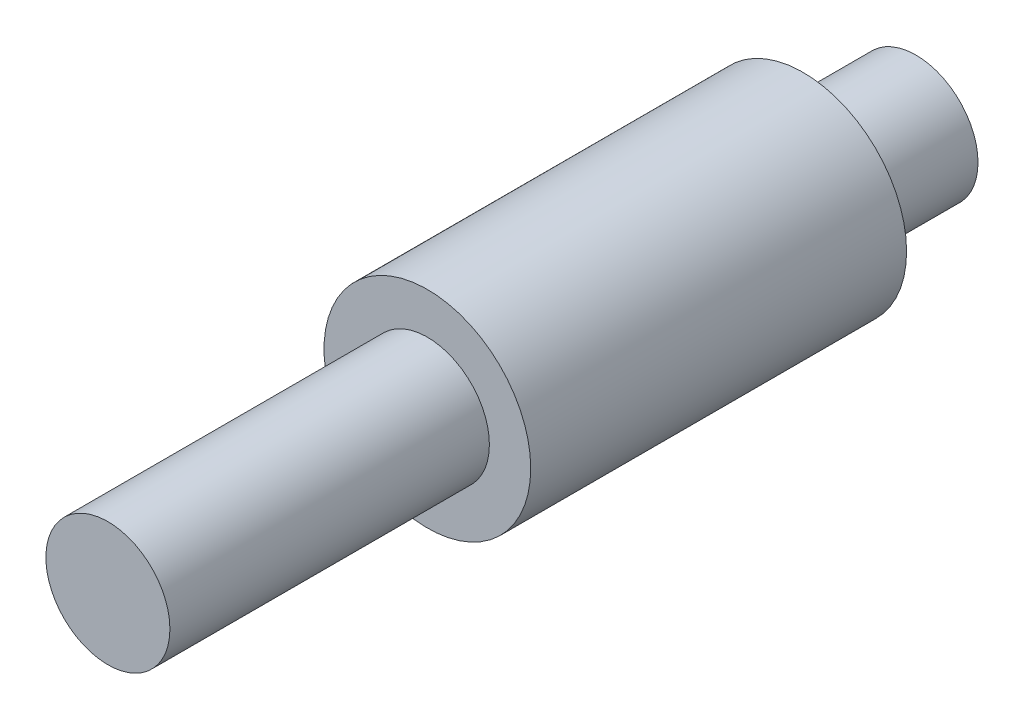
ISO-10303-21;
HEADER;
FILE_DESCRIPTION(('STEP AP214'),'2;1');
FILE_NAME('part.step','',(''),(''),'','','');
FILE_SCHEMA(('AUTOMOTIVE_DESIGN { 1 0 10303 214 1 1 1 1 }'));
ENDSEC;
DATA;
#1=APPLICATION_CONTEXT('core data for automotive mechanical design processes');
#2=APPLICATION_PROTOCOL_DEFINITION('international standard','automotive_design',2000,#1);
#3=PRODUCT_CONTEXT('',#1,'mechanical');
#4=PRODUCT('Part','Part','',(#3));
#5=PRODUCT_RELATED_PRODUCT_CATEGORY('part','',(#4));
#6=PRODUCT_DEFINITION_FORMATION('','',#4);
#7=PRODUCT_DEFINITION_CONTEXT('part definition',#1,'design');
#8=PRODUCT_DEFINITION('design','',#6,#7);
#9=PRODUCT_DEFINITION_SHAPE('','',#8);
#10=(LENGTH_UNIT() NAMED_UNIT(*) SI_UNIT(.MILLI.,.METRE.));
#11=(NAMED_UNIT(*) PLANE_ANGLE_UNIT() SI_UNIT($,.RADIAN.));
#12=(NAMED_UNIT(*) SI_UNIT($,.STERADIAN.) SOLID_ANGLE_UNIT());
#13=UNCERTAINTY_MEASURE_WITH_UNIT(LENGTH_MEASURE(1.E-05),#10,'distance_accuracy_value','');
#14=(GEOMETRIC_REPRESENTATION_CONTEXT(3) GLOBAL_UNCERTAINTY_ASSIGNED_CONTEXT((#13)) GLOBAL_UNIT_ASSIGNED_CONTEXT((#10,
#11,#12)) REPRESENTATION_CONTEXT('',''));
#15=CARTESIAN_POINT('',(0.,0.,0.));
#16=DIRECTION('',(0.,0.,1.));
#17=DIRECTION('',(1.,0.,0.));
#18=AXIS2_PLACEMENT_3D('',#15,#16,#17);
#19=CARTESIAN_POINT('',(0.,0.,0.));
#20=DIRECTION('',(0.,0.,1.));
#21=DIRECTION('',(1.,0.,0.));
#22=AXIS2_PLACEMENT_3D('',#19,#20,#21);
#23=CYLINDRICAL_SURFACE('',#22,3.3);
#24=CARTESIAN_POINT('',(0.,0.,0.));
#25=DIRECTION('',(0.,0.,1.));
#26=DIRECTION('',(1.,0.,0.));
#27=AXIS2_PLACEMENT_3D('',#24,#25,#26);
#28=CIRCLE('',#27,3.3);
#29=CARTESIAN_POINT('',(3.3,0.,0.));
#30=VERTEX_POINT('',#29);
#31=EDGE_CURVE('E10',#30,#30,#28,.T.);
#32=ORIENTED_EDGE('',*,*,#31,.T.);
#33=EDGE_LOOP('',(#32));
#34=FACE_BOUND('',#33,.T.);
#35=CARTESIAN_POINT('',(0.,0.,6.));
#36=DIRECTION('',(0.,0.,1.));
#37=DIRECTION('',(1.,0.,0.));
#38=AXIS2_PLACEMENT_3D('',#35,#36,#37);
#39=CIRCLE('',#38,3.3);
#40=CARTESIAN_POINT('',(3.3,0.,6.));
#41=VERTEX_POINT('',#40);
#42=EDGE_CURVE('E57',#41,#41,#39,.T.);
#43=ORIENTED_EDGE('',*,*,#42,.F.);
#44=EDGE_LOOP('',(#43));
#45=FACE_BOUND('',#44,.T.);
#46=ADVANCED_FACE('F35',(#34,#45),#23,.T.);
#47=CARTESIAN_POINT('',(3.3,0.,0.));
#48=DIRECTION('',(0.,0.,-1.));
#49=DIRECTION('',(-1.,0.,0.));
#50=AXIS2_PLACEMENT_3D('',#47,#48,#49);
#51=PLANE('',#50);
#52=ORIENTED_EDGE('',*,*,#31,.F.);
#53=EDGE_LOOP('',(#52));
#54=FACE_BOUND('',#53,.T.);
#55=ADVANCED_FACE('F65',(#54),#51,.T.);
#56=CARTESIAN_POINT('',(0.,0.,43.));
#57=DIRECTION('',(0.,0.,1.));
#58=DIRECTION('',(1.,0.,0.));
#59=AXIS2_PLACEMENT_3D('',#56,#57,#58);
#60=PLANE('',#59);
#61=CARTESIAN_POINT('',(0.,0.,43.));
#62=DIRECTION('',(0.,0.,1.));
#63=DIRECTION('',(1.,0.,0.));
#64=AXIS2_PLACEMENT_3D('',#61,#62,#63);
#65=CIRCLE('',#64,3.3);
#66=CARTESIAN_POINT('',(3.3,0.,43.));
#67=VERTEX_POINT('',#66);
#68=EDGE_CURVE('E41',#67,#67,#65,.T.);
#69=ORIENTED_EDGE('',*,*,#68,.T.);
#70=EDGE_LOOP('',(#69));
#71=FACE_BOUND('',#70,.T.);
#72=ADVANCED_FACE('F69',(#71),#60,.T.);
#73=CARTESIAN_POINT('',(0.,0.,0.));
#74=DIRECTION('',(0.,0.,1.));
#75=DIRECTION('',(1.,0.,0.));
#76=AXIS2_PLACEMENT_3D('',#73,#74,#75);
#77=CYLINDRICAL_SURFACE('',#76,3.3);
#78=CARTESIAN_POINT('',(0.,0.,26.));
#79=DIRECTION('',(0.,0.,1.));
#80=DIRECTION('',(1.,0.,0.));
#81=AXIS2_PLACEMENT_3D('',#78,#79,#80);
#82=CIRCLE('',#81,3.3);
#83=CARTESIAN_POINT('',(3.3,0.,26.));
#84=VERTEX_POINT('',#83);
#85=EDGE_CURVE('E45',#84,#84,#82,.T.);
#86=ORIENTED_EDGE('',*,*,#85,.T.);
#87=EDGE_LOOP('',(#86));
#88=FACE_BOUND('',#87,.T.);
#89=ORIENTED_EDGE('',*,*,#68,.F.);
#90=EDGE_LOOP('',(#89));
#91=FACE_BOUND('',#90,.T.);
#92=ADVANCED_FACE('F74',(#88,#91),#77,.T.);
#93=CARTESIAN_POINT('',(3.3,0.,26.));
#94=DIRECTION('',(0.,0.,1.));
#95=DIRECTION('',(1.,0.,0.));
#96=AXIS2_PLACEMENT_3D('',#93,#94,#95);
#97=PLANE('',#96);
#98=CARTESIAN_POINT('',(0.,0.,26.));
#99=DIRECTION('',(0.,0.,1.));
#100=DIRECTION('',(1.,0.,0.));
#101=AXIS2_PLACEMENT_3D('',#98,#99,#100);
#102=CIRCLE('',#101,5.5);
#103=CARTESIAN_POINT('',(5.5,0.,26.));
#104=VERTEX_POINT('',#103);
#105=EDGE_CURVE('E49',#104,#104,#102,.T.);
#106=ORIENTED_EDGE('',*,*,#105,.T.);
#107=EDGE_LOOP('',(#106));
#108=FACE_BOUND('',#107,.T.);
#109=ORIENTED_EDGE('',*,*,#85,.F.);
#110=EDGE_LOOP('',(#109));
#111=FACE_BOUND('',#110,.T.);
#112=ADVANCED_FACE('F79',(#108,#111),#97,.T.);
#113=CARTESIAN_POINT('',(0.,0.,0.));
#114=DIRECTION('',(0.,0.,1.));
#115=DIRECTION('',(1.,0.,0.));
#116=AXIS2_PLACEMENT_3D('',#113,#114,#115);
#117=CYLINDRICAL_SURFACE('',#116,5.5);
#118=CARTESIAN_POINT('',(0.,0.,6.));
#119=DIRECTION('',(0.,0.,1.));
#120=DIRECTION('',(1.,0.,0.));
#121=AXIS2_PLACEMENT_3D('',#118,#119,#120);
#122=CIRCLE('',#121,5.5);
#123=CARTESIAN_POINT('',(5.5,0.,6.));
#124=VERTEX_POINT('',#123);
#125=EDGE_CURVE('E54',#124,#124,#122,.T.);
#126=ORIENTED_EDGE('',*,*,#125,.T.);
#127=EDGE_LOOP('',(#126));
#128=FACE_BOUND('',#127,.T.);
#129=ORIENTED_EDGE('',*,*,#105,.F.);
#130=EDGE_LOOP('',(#129));
#131=FACE_BOUND('',#130,.T.);
#132=ADVANCED_FACE('F83',(#128,#131),#117,.T.);
#133=CARTESIAN_POINT('',(5.5,0.,6.));
#134=DIRECTION('',(0.,0.,-1.));
#135=DIRECTION('',(-1.,0.,0.));
#136=AXIS2_PLACEMENT_3D('',#133,#134,#135);
#137=PLANE('',#136);
#138=ORIENTED_EDGE('',*,*,#42,.T.);
#139=EDGE_LOOP('',(#138));
#140=FACE_BOUND('',#139,.T.);
#141=ORIENTED_EDGE('',*,*,#125,.F.);
#142=EDGE_LOOP('',(#141));
#143=FACE_BOUND('',#142,.T.);
#144=ADVANCED_FACE('F61',(#140,#143),#137,.T.);
#145=CLOSED_SHELL('',(#46,#55,#72,#92,#112,#132,#144));
#146=MANIFOLD_SOLID_BREP('B2',#145);
#147=ADVANCED_BREP_SHAPE_REPRESENTATION('',(#18,#146),#14);
#148=SHAPE_DEFINITION_REPRESENTATION(#9,#147);
ENDSEC;
END-ISO-10303-21;
